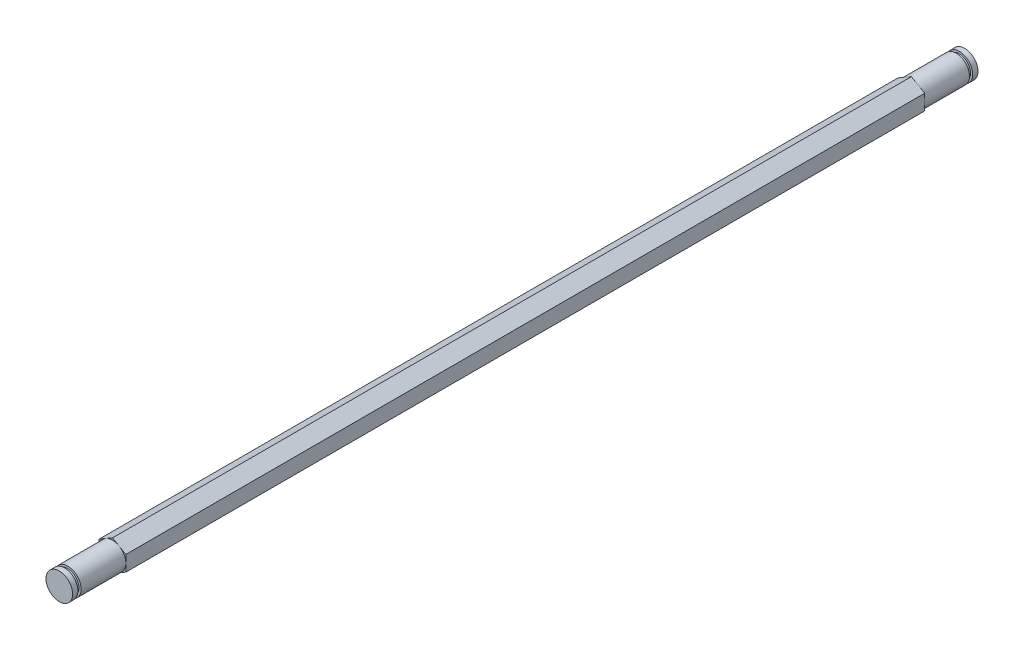
ISO-10303-21;
HEADER;
FILE_DESCRIPTION(('STEP AP214'),'2;1');
FILE_NAME('part.step','',(''),(''),'','','');
FILE_SCHEMA(('AUTOMOTIVE_DESIGN { 1 0 10303 214 1 1 1 1 }'));
ENDSEC;
DATA;
#1=APPLICATION_CONTEXT('core data for automotive mechanical design processes');
#2=APPLICATION_PROTOCOL_DEFINITION('international standard','automotive_design',2000,#1);
#3=PRODUCT_CONTEXT('',#1,'mechanical');
#4=PRODUCT('Part','Part','',(#3));
#5=PRODUCT_RELATED_PRODUCT_CATEGORY('part','',(#4));
#6=PRODUCT_DEFINITION_FORMATION('','',#4);
#7=PRODUCT_DEFINITION_CONTEXT('part definition',#1,'design');
#8=PRODUCT_DEFINITION('design','',#6,#7);
#9=PRODUCT_DEFINITION_SHAPE('','',#8);
#10=(LENGTH_UNIT() NAMED_UNIT(*) SI_UNIT(.MILLI.,.METRE.));
#11=(NAMED_UNIT(*) PLANE_ANGLE_UNIT() SI_UNIT($,.RADIAN.));
#12=(NAMED_UNIT(*) SI_UNIT($,.STERADIAN.) SOLID_ANGLE_UNIT());
#13=UNCERTAINTY_MEASURE_WITH_UNIT(LENGTH_MEASURE(1.E-05),#10,'distance_accuracy_value','');
#14=(GEOMETRIC_REPRESENTATION_CONTEXT(3) GLOBAL_UNCERTAINTY_ASSIGNED_CONTEXT((#13)) GLOBAL_UNIT_ASSIGNED_CONTEXT((#10,
#11,#12)) REPRESENTATION_CONTEXT('',''));
#15=CARTESIAN_POINT('',(0.,0.,0.));
#16=DIRECTION('',(0.,0.,1.));
#17=DIRECTION('',(1.,0.,0.));
#18=AXIS2_PLACEMENT_3D('',#15,#16,#17);
#19=CARTESIAN_POINT('',(0.,0.,12.7));
#20=DIRECTION('',(0.,0.,-1.));
#21=DIRECTION('',(-1.,0.,0.));
#22=AXIS2_PLACEMENT_3D('',#19,#20,#21);
#23=CYLINDRICAL_SURFACE('',#22,3.175);
#24=CARTESIAN_POINT('',(0.,0.,12.7));
#25=DIRECTION('',(0.,0.,-1.));
#26=DIRECTION('',(-1.,0.,0.));
#27=AXIS2_PLACEMENT_3D('',#24,#25,#26);
#28=CIRCLE('',#27,3.175);
#29=CARTESIAN_POINT('',(-1.5875,2.74963065701559,12.7));
#30=VERTEX_POINT('',#29);
#31=CARTESIAN_POINT('',(1.5875,2.74963065701559,12.7));
#32=VERTEX_POINT('',#31);
#33=EDGE_CURVE('E174',#30,#32,#28,.T.);
#34=ORIENTED_EDGE('',*,*,#33,.T.);
#35=CARTESIAN_POINT('',(3.17499999999999,0.,12.7));
#36=VERTEX_POINT('',#35);
#37=EDGE_CURVE('E69',#32,#36,#28,.T.);
#38=ORIENTED_EDGE('',*,*,#37,.T.);
#39=CARTESIAN_POINT('',(1.5875,-2.74963065701559,12.7));
#40=VERTEX_POINT('',#39);
#41=EDGE_CURVE('E285',#36,#40,#28,.T.);
#42=ORIENTED_EDGE('',*,*,#41,.T.);
#43=CARTESIAN_POINT('',(-1.5875,-2.74963065701559,12.7));
#44=VERTEX_POINT('',#43);
#45=EDGE_CURVE('E274',#40,#44,#28,.T.);
#46=ORIENTED_EDGE('',*,*,#45,.T.);
#47=CARTESIAN_POINT('',(-3.175,0.,12.7));
#48=VERTEX_POINT('',#47);
#49=EDGE_CURVE('E142',#44,#48,#28,.T.);
#50=ORIENTED_EDGE('',*,*,#49,.T.);
#51=EDGE_CURVE('E170',#48,#30,#28,.T.);
#52=ORIENTED_EDGE('',*,*,#51,.T.);
#53=EDGE_LOOP('',(#34,#38,#42,#46,#50,#52));
#54=FACE_BOUND('',#53,.T.);
#55=CARTESIAN_POINT('',(0.,0.,2.03199999999999));
#56=DIRECTION('',(0.,0.,-1.));
#57=DIRECTION('',(-1.,0.,0.));
#58=AXIS2_PLACEMENT_3D('',#55,#56,#57);
#59=CIRCLE('',#58,3.175);
#60=CARTESIAN_POINT('',(-3.175,0.,2.03199999999999));
#61=VERTEX_POINT('',#60);
#62=EDGE_CURVE('E48',#61,#61,#59,.F.);
#63=ORIENTED_EDGE('',*,*,#62,.T.);
#64=EDGE_LOOP('',(#63));
#65=FACE_BOUND('',#64,.T.);
#66=ADVANCED_FACE('F44',(#54,#65),#23,.T.);
#67=CARTESIAN_POINT('',(0.,0.,203.2));
#68=DIRECTION('',(0.,0.,1.));
#69=DIRECTION('',(1.,0.,0.));
#70=AXIS2_PLACEMENT_3D('',#67,#68,#69);
#71=CYLINDRICAL_SURFACE('',#70,3.175);
#72=CARTESIAN_POINT('',(0.,0.,203.2));
#73=DIRECTION('',(0.,0.,1.));
#74=DIRECTION('',(1.,0.,0.));
#75=AXIS2_PLACEMENT_3D('',#72,#73,#74);
#76=CIRCLE('',#75,3.175);
#77=CARTESIAN_POINT('',(3.17499999999999,0.,203.2));
#78=VERTEX_POINT('',#77);
#79=CARTESIAN_POINT('',(1.5875,2.74963065701559,203.2));
#80=VERTEX_POINT('',#79);
#81=EDGE_CURVE('E61',#78,#80,#76,.T.);
#82=ORIENTED_EDGE('',*,*,#81,.T.);
#83=CARTESIAN_POINT('',(-1.5875,2.74963065701559,203.2));
#84=VERTEX_POINT('',#83);
#85=EDGE_CURVE('E147',#80,#84,#76,.T.);
#86=ORIENTED_EDGE('',*,*,#85,.T.);
#87=CARTESIAN_POINT('',(-3.175,0.,203.2));
#88=VERTEX_POINT('',#87);
#89=EDGE_CURVE('E155',#84,#88,#76,.T.);
#90=ORIENTED_EDGE('',*,*,#89,.T.);
#91=CARTESIAN_POINT('',(-1.5875,-2.74963065701559,203.2));
#92=VERTEX_POINT('',#91);
#93=EDGE_CURVE('E251',#88,#92,#76,.T.);
#94=ORIENTED_EDGE('',*,*,#93,.T.);
#95=CARTESIAN_POINT('',(1.5875,-2.74963065701559,203.2));
#96=VERTEX_POINT('',#95);
#97=EDGE_CURVE('E256',#92,#96,#76,.T.);
#98=ORIENTED_EDGE('',*,*,#97,.T.);
#99=EDGE_CURVE('E161',#96,#78,#76,.T.);
#100=ORIENTED_EDGE('',*,*,#99,.T.);
#101=EDGE_LOOP('',(#82,#86,#90,#94,#98,#100));
#102=FACE_BOUND('',#101,.T.);
#103=CARTESIAN_POINT('',(0.,0.,213.868));
#104=DIRECTION('',(0.,0.,1.));
#105=DIRECTION('',(1.,0.,0.));
#106=AXIS2_PLACEMENT_3D('',#103,#104,#105);
#107=CIRCLE('',#106,3.175);
#108=CARTESIAN_POINT('',(3.175,0.,213.868));
#109=VERTEX_POINT('',#108);
#110=EDGE_CURVE('E216',#109,#109,#107,.F.);
#111=ORIENTED_EDGE('',*,*,#110,.T.);
#112=EDGE_LOOP('',(#111));
#113=FACE_BOUND('',#112,.T.);
#114=ADVANCED_FACE('F157',(#102,#113),#71,.T.);
#115=CARTESIAN_POINT('',(3.17499999999998,1.83308710467708,215.9));
#116=DIRECTION('',(-0.5,-0.866025403784438,0.));
#117=DIRECTION('',(0.866025403784439,-0.5,0.));
#118=AXIS2_PLACEMENT_3D('',#115,#116,#117);
#119=PLANE('',#118);
#120=DIRECTION('',(-0.866025403784439,0.5,0.));
#121=VECTOR('',#120,1.);
#122=CARTESIAN_POINT('',(3.17499999999998,1.83308710467708,203.2));
#123=LINE('',#122,#121);
#124=CARTESIAN_POINT('',(3.17499999999998,1.83308710467708,203.2));
#125=VERTEX_POINT('',#124);
#126=EDGE_CURVE('E135',#125,#80,#123,.T.);
#127=ORIENTED_EDGE('',*,*,#126,.F.);
#128=DIRECTION('',(0.,0.,-1.));
#129=VECTOR('',#128,1.);
#130=CARTESIAN_POINT('',(3.17499999999998,1.83308710467708,215.9));
#131=LINE('',#130,#129);
#132=CARTESIAN_POINT('',(3.17499999999998,1.83308710467708,12.7));
#133=VERTEX_POINT('',#132);
#134=EDGE_CURVE('E192',#125,#133,#131,.T.);
#135=ORIENTED_EDGE('',*,*,#134,.T.);
#136=DIRECTION('',(0.866025403784439,-0.5,0.));
#137=VECTOR('',#136,1.);
#138=CARTESIAN_POINT('',(3.17499999999998,1.83308710467708,12.7));
#139=LINE('',#138,#137);
#140=EDGE_CURVE('E176',#32,#133,#139,.T.);
#141=ORIENTED_EDGE('',*,*,#140,.F.);
#142=CARTESIAN_POINT('',(0.,3.66617420935413,12.7));
#143=VERTEX_POINT('',#142);
#144=EDGE_CURVE('E180',#143,#32,#139,.T.);
#145=ORIENTED_EDGE('',*,*,#144,.F.);
#146=DIRECTION('',(0.,0.,-1.));
#147=VECTOR('',#146,1.);
#148=CARTESIAN_POINT('',(0.,3.66617420935413,215.9));
#149=LINE('',#148,#147);
#150=CARTESIAN_POINT('',(0.,3.66617420935413,203.2));
#151=VERTEX_POINT('',#150);
#152=EDGE_CURVE('E165',#151,#143,#149,.T.);
#153=ORIENTED_EDGE('',*,*,#152,.F.);
#154=EDGE_CURVE('E143',#80,#151,#123,.T.);
#155=ORIENTED_EDGE('',*,*,#154,.F.);
#156=EDGE_LOOP('',(#127,#135,#141,#145,#153,#155));
#157=FACE_BOUND('',#156,.T.);
#158=ADVANCED_FACE('F46',(#157),#119,.F.);
#159=CARTESIAN_POINT('',(0.,3.66617420935413,215.9));
#160=DIRECTION('',(0.5,-0.866025403784439,0.));
#161=DIRECTION('',(0.866025403784439,0.5,0.));
#162=AXIS2_PLACEMENT_3D('',#159,#160,#161);
#163=PLANE('',#162);
#164=DIRECTION('',(-0.866025403784439,-0.5,0.));
#165=VECTOR('',#164,1.);
#166=CARTESIAN_POINT('',(0.,3.66617420935413,203.2));
#167=LINE('',#166,#165);
#168=EDGE_CURVE('E150',#151,#84,#167,.T.);
#169=ORIENTED_EDGE('',*,*,#168,.F.);
#170=ORIENTED_EDGE('',*,*,#152,.T.);
#171=DIRECTION('',(0.866025403784439,0.5,0.));
#172=VECTOR('',#171,1.);
#173=CARTESIAN_POINT('',(0.,3.66617420935413,12.7));
#174=LINE('',#173,#172);
#175=EDGE_CURVE('E183',#30,#143,#174,.T.);
#176=ORIENTED_EDGE('',*,*,#175,.F.);
#177=CARTESIAN_POINT('',(-3.175,1.83308710467706,12.7));
#178=VERTEX_POINT('',#177);
#179=EDGE_CURVE('E187',#178,#30,#174,.T.);
#180=ORIENTED_EDGE('',*,*,#179,.F.);
#181=DIRECTION('',(0.,0.,-1.));
#182=VECTOR('',#181,1.);
#183=CARTESIAN_POINT('',(-3.175,1.83308710467706,215.9));
#184=LINE('',#183,#182);
#185=CARTESIAN_POINT('',(-3.175,1.83308710467706,203.2));
#186=VERTEX_POINT('',#185);
#187=EDGE_CURVE('E200',#186,#178,#184,.T.);
#188=ORIENTED_EDGE('',*,*,#187,.F.);
#189=EDGE_CURVE('E166',#84,#186,#167,.T.);
#190=ORIENTED_EDGE('',*,*,#189,.F.);
#191=EDGE_LOOP('',(#169,#170,#176,#180,#188,#190));
#192=FACE_BOUND('',#191,.T.);
#193=ADVANCED_FACE('F345',(#192),#163,.F.);
#194=CARTESIAN_POINT('',(-3.175,1.83308710467706,215.9));
#195=DIRECTION('',(1.,0.,0.));
#196=DIRECTION('',(0.,0.,-1.));
#197=AXIS2_PLACEMENT_3D('',#194,#195,#196);
#198=PLANE('',#197);
#199=DIRECTION('',(0.,-1.,0.));
#200=VECTOR('',#199,1.);
#201=CARTESIAN_POINT('',(-3.175,1.83308710467706,203.2));
#202=LINE('',#201,#200);
#203=EDGE_CURVE('E243',#186,#88,#202,.T.);
#204=ORIENTED_EDGE('',*,*,#203,.F.);
#205=ORIENTED_EDGE('',*,*,#187,.T.);
#206=DIRECTION('',(0.,1.,0.));
#207=VECTOR('',#206,1.);
#208=CARTESIAN_POINT('',(-3.175,1.83308710467706,12.7));
#209=LINE('',#208,#207);
#210=EDGE_CURVE('E188',#48,#178,#209,.T.);
#211=ORIENTED_EDGE('',*,*,#210,.F.);
#212=CARTESIAN_POINT('',(-3.175,-1.83308710467707,12.7));
#213=VERTEX_POINT('',#212);
#214=EDGE_CURVE('E191',#213,#48,#209,.T.);
#215=ORIENTED_EDGE('',*,*,#214,.F.);
#216=DIRECTION('',(0.,0.,-1.));
#217=VECTOR('',#216,1.);
#218=CARTESIAN_POINT('',(-3.175,-1.83308710467707,215.9));
#219=LINE('',#218,#217);
#220=CARTESIAN_POINT('',(-3.175,-1.83308710467707,203.2));
#221=VERTEX_POINT('',#220);
#222=EDGE_CURVE('E198',#221,#213,#219,.T.);
#223=ORIENTED_EDGE('',*,*,#222,.F.);
#224=EDGE_CURVE('E242',#88,#221,#202,.T.);
#225=ORIENTED_EDGE('',*,*,#224,.F.);
#226=EDGE_LOOP('',(#204,#205,#211,#215,#223,#225));
#227=FACE_BOUND('',#226,.T.);
#228=ADVANCED_FACE('F343',(#227),#198,.F.);
#229=CARTESIAN_POINT('',(-3.175,-1.83308710467707,215.9));
#230=DIRECTION('',(0.5,0.866025403784439,0.));
#231=DIRECTION('',(-0.866025403784439,0.5,0.));
#232=AXIS2_PLACEMENT_3D('',#229,#230,#231);
#233=PLANE('',#232);
#234=DIRECTION('',(0.866025403784439,-0.5,0.));
#235=VECTOR('',#234,1.);
#236=CARTESIAN_POINT('',(-3.175,-1.83308710467707,203.2));
#237=LINE('',#236,#235);
#238=EDGE_CURVE('E241',#221,#92,#237,.T.);
#239=ORIENTED_EDGE('',*,*,#238,.F.);
#240=ORIENTED_EDGE('',*,*,#222,.T.);
#241=DIRECTION('',(-0.866025403784439,0.5,0.));
#242=VECTOR('',#241,1.);
#243=CARTESIAN_POINT('',(-3.175,-1.83308710467707,12.7));
#244=LINE('',#243,#242);
#245=EDGE_CURVE('E184',#44,#213,#244,.T.);
#246=ORIENTED_EDGE('',*,*,#245,.F.);
#247=CARTESIAN_POINT('',(0.,-3.66617420935413,12.7));
#248=VERTEX_POINT('',#247);
#249=EDGE_CURVE('E181',#248,#44,#244,.T.);
#250=ORIENTED_EDGE('',*,*,#249,.F.);
#251=DIRECTION('',(0.,0.,-1.));
#252=VECTOR('',#251,1.);
#253=CARTESIAN_POINT('',(0.,-3.66617420935413,215.9));
#254=LINE('',#253,#252);
#255=CARTESIAN_POINT('',(0.,-3.66617420935413,203.2));
#256=VERTEX_POINT('',#255);
#257=EDGE_CURVE('E196',#256,#248,#254,.T.);
#258=ORIENTED_EDGE('',*,*,#257,.F.);
#259=EDGE_CURVE('E240',#92,#256,#237,.T.);
#260=ORIENTED_EDGE('',*,*,#259,.F.);
#261=EDGE_LOOP('',(#239,#240,#246,#250,#258,#260));
#262=FACE_BOUND('',#261,.T.);
#263=ADVANCED_FACE('F261',(#262),#233,.F.);
#264=CARTESIAN_POINT('',(0.,-3.66617420935413,215.9));
#265=DIRECTION('',(-0.5,0.866025403784439,0.));
#266=DIRECTION('',(-0.866025403784439,-0.5,0.));
#267=AXIS2_PLACEMENT_3D('',#264,#265,#266);
#268=PLANE('',#267);
#269=DIRECTION('',(0.866025403784439,0.5,0.));
#270=VECTOR('',#269,1.);
#271=CARTESIAN_POINT('',(0.,-3.66617420935413,203.2));
#272=LINE('',#271,#270);
#273=EDGE_CURVE('E239',#256,#96,#272,.T.);
#274=ORIENTED_EDGE('',*,*,#273,.F.);
#275=ORIENTED_EDGE('',*,*,#257,.T.);
#276=DIRECTION('',(-0.866025403784439,-0.5,0.));
#277=VECTOR('',#276,1.);
#278=CARTESIAN_POINT('',(0.,-3.66617420935413,12.7));
#279=LINE('',#278,#277);
#280=EDGE_CURVE('E177',#40,#248,#279,.T.);
#281=ORIENTED_EDGE('',*,*,#280,.F.);
#282=CARTESIAN_POINT('',(3.17499999999999,-1.83308710467707,12.7));
#283=VERTEX_POINT('',#282);
#284=EDGE_CURVE('E173',#283,#40,#279,.T.);
#285=ORIENTED_EDGE('',*,*,#284,.F.);
#286=DIRECTION('',(0.,0.,-1.));
#287=VECTOR('',#286,1.);
#288=CARTESIAN_POINT('',(3.17499999999999,-1.83308710467707,215.9));
#289=LINE('',#288,#287);
#290=CARTESIAN_POINT('',(3.17499999999999,-1.83308710467707,203.2));
#291=VERTEX_POINT('',#290);
#292=EDGE_CURVE('E194',#291,#283,#289,.T.);
#293=ORIENTED_EDGE('',*,*,#292,.F.);
#294=EDGE_CURVE('E162',#96,#291,#272,.T.);
#295=ORIENTED_EDGE('',*,*,#294,.F.);
#296=EDGE_LOOP('',(#274,#275,#281,#285,#293,#295));
#297=FACE_BOUND('',#296,.T.);
#298=ADVANCED_FACE('F267',(#297),#268,.F.);
#299=CARTESIAN_POINT('',(3.17499999999999,-1.83308710467707,215.9));
#300=DIRECTION('',(-1.,0.,0.));
#301=DIRECTION('',(0.,-1.,0.));
#302=AXIS2_PLACEMENT_3D('',#299,#300,#301);
#303=PLANE('',#302);
#304=DIRECTION('',(0.,1.,0.));
#305=VECTOR('',#304,1.);
#306=CARTESIAN_POINT('',(3.17499999999999,-1.83308710467707,203.2));
#307=LINE('',#306,#305);
#308=EDGE_CURVE('E12',#291,#78,#307,.T.);
#309=ORIENTED_EDGE('',*,*,#308,.F.);
#310=ORIENTED_EDGE('',*,*,#292,.T.);
#311=DIRECTION('',(0.,-1.,0.));
#312=VECTOR('',#311,1.);
#313=CARTESIAN_POINT('',(3.17499999999999,-1.83308710467707,12.7));
#314=LINE('',#313,#312);
#315=EDGE_CURVE('E206',#36,#283,#314,.T.);
#316=ORIENTED_EDGE('',*,*,#315,.F.);
#317=EDGE_CURVE('E209',#133,#36,#314,.T.);
#318=ORIENTED_EDGE('',*,*,#317,.F.);
#319=ORIENTED_EDGE('',*,*,#134,.F.);
#320=EDGE_CURVE('E53',#78,#125,#307,.T.);
#321=ORIENTED_EDGE('',*,*,#320,.F.);
#322=EDGE_LOOP('',(#309,#310,#316,#318,#319,#321));
#323=FACE_BOUND('',#322,.T.);
#324=ADVANCED_FACE('F291',(#323),#303,.F.);
#325=CARTESIAN_POINT('',(0.,0.,12.7));
#326=DIRECTION('',(0.,0.,-1.));
#327=DIRECTION('',(-1.,0.,0.));
#328=AXIS2_PLACEMENT_3D('',#325,#326,#327);
#329=PLANE('',#328);
#330=ORIENTED_EDGE('',*,*,#214,.T.);
#331=ORIENTED_EDGE('',*,*,#49,.F.);
#332=ORIENTED_EDGE('',*,*,#245,.T.);
#333=EDGE_LOOP('',(#330,#331,#332));
#334=FACE_BOUND('',#333,.T.);
#335=ADVANCED_FACE('F338',(#334),#329,.T.);
#336=ORIENTED_EDGE('',*,*,#210,.T.);
#337=ORIENTED_EDGE('',*,*,#179,.T.);
#338=ORIENTED_EDGE('',*,*,#51,.F.);
#339=EDGE_LOOP('',(#336,#337,#338));
#340=FACE_BOUND('',#339,.T.);
#341=ADVANCED_FACE('F362',(#340),#329,.T.);
#342=ORIENTED_EDGE('',*,*,#175,.T.);
#343=ORIENTED_EDGE('',*,*,#144,.T.);
#344=ORIENTED_EDGE('',*,*,#33,.F.);
#345=EDGE_LOOP('',(#342,#343,#344));
#346=FACE_BOUND('',#345,.T.);
#347=ADVANCED_FACE('F277',(#346),#329,.T.);
#348=ORIENTED_EDGE('',*,*,#249,.T.);
#349=ORIENTED_EDGE('',*,*,#45,.F.);
#350=ORIENTED_EDGE('',*,*,#280,.T.);
#351=EDGE_LOOP('',(#348,#349,#350));
#352=FACE_BOUND('',#351,.T.);
#353=ADVANCED_FACE('F271',(#352),#329,.T.);
#354=ORIENTED_EDGE('',*,*,#140,.T.);
#355=ORIENTED_EDGE('',*,*,#317,.T.);
#356=ORIENTED_EDGE('',*,*,#37,.F.);
#357=EDGE_LOOP('',(#354,#355,#356));
#358=FACE_BOUND('',#357,.T.);
#359=ADVANCED_FACE('F282',(#358),#329,.T.);
#360=ORIENTED_EDGE('',*,*,#284,.T.);
#361=ORIENTED_EDGE('',*,*,#41,.F.);
#362=ORIENTED_EDGE('',*,*,#315,.T.);
#363=EDGE_LOOP('',(#360,#361,#362));
#364=FACE_BOUND('',#363,.T.);
#365=ADVANCED_FACE('F294',(#364),#329,.T.);
#366=CARTESIAN_POINT('',(0.,0.,203.2));
#367=DIRECTION('',(0.,0.,1.));
#368=DIRECTION('',(1.,0.,0.));
#369=AXIS2_PLACEMENT_3D('',#366,#367,#368);
#370=PLANE('',#369);
#371=ORIENTED_EDGE('',*,*,#126,.T.);
#372=ORIENTED_EDGE('',*,*,#81,.F.);
#373=ORIENTED_EDGE('',*,*,#320,.T.);
#374=EDGE_LOOP('',(#371,#372,#373));
#375=FACE_BOUND('',#374,.T.);
#376=ADVANCED_FACE('F137',(#375),#370,.T.);
#377=ORIENTED_EDGE('',*,*,#154,.T.);
#378=ORIENTED_EDGE('',*,*,#168,.T.);
#379=ORIENTED_EDGE('',*,*,#85,.F.);
#380=EDGE_LOOP('',(#377,#378,#379));
#381=FACE_BOUND('',#380,.T.);
#382=ADVANCED_FACE('F148',(#381),#370,.T.);
#383=ORIENTED_EDGE('',*,*,#189,.T.);
#384=ORIENTED_EDGE('',*,*,#203,.T.);
#385=ORIENTED_EDGE('',*,*,#89,.F.);
#386=EDGE_LOOP('',(#383,#384,#385));
#387=FACE_BOUND('',#386,.T.);
#388=ADVANCED_FACE('F356',(#387),#370,.T.);
#389=ORIENTED_EDGE('',*,*,#224,.T.);
#390=ORIENTED_EDGE('',*,*,#238,.T.);
#391=ORIENTED_EDGE('',*,*,#93,.F.);
#392=EDGE_LOOP('',(#389,#390,#391));
#393=FACE_BOUND('',#392,.T.);
#394=ADVANCED_FACE('F249',(#393),#370,.T.);
#395=ORIENTED_EDGE('',*,*,#259,.T.);
#396=ORIENTED_EDGE('',*,*,#273,.T.);
#397=ORIENTED_EDGE('',*,*,#97,.F.);
#398=EDGE_LOOP('',(#395,#396,#397));
#399=FACE_BOUND('',#398,.T.);
#400=ADVANCED_FACE('F257',(#399),#370,.T.);
#401=ORIENTED_EDGE('',*,*,#294,.T.);
#402=ORIENTED_EDGE('',*,*,#308,.T.);
#403=ORIENTED_EDGE('',*,*,#99,.F.);
#404=EDGE_LOOP('',(#401,#402,#403));
#405=FACE_BOUND('',#404,.T.);
#406=ADVANCED_FACE('F296',(#405),#370,.T.);
#407=CARTESIAN_POINT('',(0.,0.,213.868));
#408=DIRECTION('',(0.,0.,1.));
#409=DIRECTION('',(1.,0.,0.));
#410=AXIS2_PLACEMENT_3D('',#407,#408,#409);
#411=PLANE('',#410);
#412=ORIENTED_EDGE('',*,*,#110,.F.);
#413=EDGE_LOOP('',(#412));
#414=FACE_BOUND('',#413,.T.);
#415=CARTESIAN_POINT('',(0.,0.,213.868));
#416=DIRECTION('',(0.,0.,1.));
#417=DIRECTION('',(1.,0.,0.));
#418=AXIS2_PLACEMENT_3D('',#415,#416,#417);
#419=CIRCLE('',#418,2.667);
#420=CARTESIAN_POINT('',(2.667,0.,213.868));
#421=VERTEX_POINT('',#420);
#422=EDGE_CURVE('E217',#421,#421,#419,.T.);
#423=ORIENTED_EDGE('',*,*,#422,.F.);
#424=EDGE_LOOP('',(#423));
#425=FACE_BOUND('',#424,.T.);
#426=ADVANCED_FACE('F298',(#414,#425),#411,.T.);
#427=CARTESIAN_POINT('',(0.,0.,214.63));
#428=DIRECTION('',(0.,0.,1.));
#429=DIRECTION('',(1.,0.,0.));
#430=AXIS2_PLACEMENT_3D('',#427,#428,#429);
#431=PLANE('',#430);
#432=CARTESIAN_POINT('',(0.,0.,214.63));
#433=DIRECTION('',(0.,0.,1.));
#434=DIRECTION('',(1.,0.,0.));
#435=AXIS2_PLACEMENT_3D('',#432,#433,#434);
#436=CIRCLE('',#435,3.175);
#437=CARTESIAN_POINT('',(3.175,0.,214.63));
#438=VERTEX_POINT('',#437);
#439=EDGE_CURVE('E213',#438,#438,#436,.F.);
#440=ORIENTED_EDGE('',*,*,#439,.T.);
#441=EDGE_LOOP('',(#440));
#442=FACE_BOUND('',#441,.T.);
#443=CARTESIAN_POINT('',(0.,0.,214.63));
#444=DIRECTION('',(0.,0.,1.));
#445=DIRECTION('',(1.,0.,0.));
#446=AXIS2_PLACEMENT_3D('',#443,#444,#445);
#447=CIRCLE('',#446,2.667);
#448=CARTESIAN_POINT('',(2.667,0.,214.63));
#449=VERTEX_POINT('',#448);
#450=EDGE_CURVE('E225',#449,#449,#447,.T.);
#451=ORIENTED_EDGE('',*,*,#450,.T.);
#452=EDGE_LOOP('',(#451));
#453=FACE_BOUND('',#452,.T.);
#454=ADVANCED_FACE('F304',(#442,#453),#431,.F.);
#455=CARTESIAN_POINT('',(0.,0.,213.868));
#456=DIRECTION('',(0.,0.,1.));
#457=DIRECTION('',(1.,0.,0.));
#458=AXIS2_PLACEMENT_3D('',#455,#456,#457);
#459=CYLINDRICAL_SURFACE('',#458,2.667);
#460=CARTESIAN_POINT('',(2.667,0.,213.868));
#461=CARTESIAN_POINT('',(2.667,0.,213.8759375));
#462=CARTESIAN_POINT('',(2.667,0.,213.883875));
#463=CARTESIAN_POINT('',(2.667,0.,213.89975));
#464=CARTESIAN_POINT('',(2.667,0.,213.9076875));
#465=CARTESIAN_POINT('',(2.667,0.,213.9235625));
#466=CARTESIAN_POINT('',(2.667,0.,213.9315));
#467=CARTESIAN_POINT('',(2.667,0.,213.947375));
#468=CARTESIAN_POINT('',(2.667,0.,213.9553125));
#469=CARTESIAN_POINT('',(2.667,0.,213.9711875));
#470=CARTESIAN_POINT('',(2.667,0.,213.979125));
#471=CARTESIAN_POINT('',(2.667,0.,213.995));
#472=CARTESIAN_POINT('',(2.667,0.,214.0029375));
#473=CARTESIAN_POINT('',(2.667,0.,214.0188125));
#474=CARTESIAN_POINT('',(2.667,0.,214.02675));
#475=CARTESIAN_POINT('',(2.667,0.,214.042625));
#476=CARTESIAN_POINT('',(2.667,0.,214.0505625));
#477=CARTESIAN_POINT('',(2.667,0.,214.0664375));
#478=CARTESIAN_POINT('',(2.667,0.,214.074375));
#479=CARTESIAN_POINT('',(2.667,0.,214.09025));
#480=CARTESIAN_POINT('',(2.667,0.,214.0981875));
#481=CARTESIAN_POINT('',(2.667,0.,214.1140625));
#482=CARTESIAN_POINT('',(2.667,0.,214.122));
#483=CARTESIAN_POINT('',(2.667,0.,214.137875));
#484=CARTESIAN_POINT('',(2.667,0.,214.1458125));
#485=CARTESIAN_POINT('',(2.667,0.,214.1616875));
#486=CARTESIAN_POINT('',(2.667,0.,214.169625));
#487=CARTESIAN_POINT('',(2.667,0.,214.1855));
#488=CARTESIAN_POINT('',(2.667,0.,214.1934375));
#489=CARTESIAN_POINT('',(2.667,0.,214.2093125));
#490=CARTESIAN_POINT('',(2.667,0.,214.21725));
#491=CARTESIAN_POINT('',(2.667,0.,214.233125));
#492=CARTESIAN_POINT('',(2.667,0.,214.2410625));
#493=CARTESIAN_POINT('',(2.667,0.,214.2569375));
#494=CARTESIAN_POINT('',(2.667,0.,214.264875));
#495=CARTESIAN_POINT('',(2.667,0.,214.28075));
#496=CARTESIAN_POINT('',(2.667,0.,214.2886875));
#497=CARTESIAN_POINT('',(2.667,0.,214.3045625));
#498=CARTESIAN_POINT('',(2.667,0.,214.3125));
#499=CARTESIAN_POINT('',(2.667,0.,214.328375));
#500=CARTESIAN_POINT('',(2.667,0.,214.3363125));
#501=CARTESIAN_POINT('',(2.667,0.,214.3521875));
#502=CARTESIAN_POINT('',(2.667,0.,214.360125));
#503=CARTESIAN_POINT('',(2.667,0.,214.376));
#504=CARTESIAN_POINT('',(2.667,0.,214.3839375));
#505=CARTESIAN_POINT('',(2.667,0.,214.3998125));
#506=CARTESIAN_POINT('',(2.667,0.,214.40775));
#507=CARTESIAN_POINT('',(2.667,0.,214.423625));
#508=CARTESIAN_POINT('',(2.667,0.,214.4315625));
#509=CARTESIAN_POINT('',(2.667,0.,214.4474375));
#510=CARTESIAN_POINT('',(2.667,0.,214.455375));
#511=CARTESIAN_POINT('',(2.667,0.,214.47125));
#512=CARTESIAN_POINT('',(2.667,0.,214.4791875));
#513=CARTESIAN_POINT('',(2.667,0.,214.4950625));
#514=CARTESIAN_POINT('',(2.667,0.,214.503));
#515=CARTESIAN_POINT('',(2.667,0.,214.518875));
#516=CARTESIAN_POINT('',(2.667,0.,214.5268125));
#517=CARTESIAN_POINT('',(2.667,0.,214.5426875));
#518=CARTESIAN_POINT('',(2.667,0.,214.550625));
#519=CARTESIAN_POINT('',(2.667,0.,214.5665));
#520=CARTESIAN_POINT('',(2.667,0.,214.5744375));
#521=CARTESIAN_POINT('',(2.667,0.,214.5903125));
#522=CARTESIAN_POINT('',(2.667,0.,214.59825));
#523=CARTESIAN_POINT('',(2.667,0.,214.614125));
#524=CARTESIAN_POINT('',(2.667,0.,214.6220625));
#525=CARTESIAN_POINT('',(2.667,0.,214.63));
#526=B_SPLINE_CURVE_WITH_KNOTS('',3,(#460,#461,#462,#463,#464,#465,#466,#467,#468,#469,#470,
#471,#472,#473,#474,#475,#476,#477,#478,#479,#480,#481,#482,#483,#484,#485,#486,#487,#488,#489,
#490,#491,#492,#493,#494,#495,#496,#497,#498,#499,#500,#501,#502,#503,#504,#505,#506,#507,#508,
#509,#510,#511,#512,#513,#514,#515,#516,#517,#518,#519,#520,#521,#522,#523,#524,#525),
.UNSPECIFIED.,.F.,.F.,(4,2,2,2,2,2,2,2,2,2,2,2,2,2,2,2,2,2,2,2,2,2,2,2,2,2,2,2,2,2,2,2,4),(0.,
0.0238124999999978,0.0476249999999956,0.0714374999999934,0.0952499999999912,0.119062499999989,
0.142874999999987,0.166687499999985,0.190499999999982,0.21431249999998,0.238124999999978,
0.261937500000003,0.285750000000001,0.309562499999999,0.333374999999997,0.357187499999995,
0.380999999999992,0.40481249999999,0.428624999999988,0.452437499999986,0.476249999999984,
0.500062499999981,0.523875000000007,0.547687500000005,0.571500000000003,0.5953125,
0.619124999999998,0.642937499999996,0.666749999999994,0.690562499999992,0.714374999999989,
0.738187499999987,0.761999999999985),.UNSPECIFIED.);
#527=EDGE_CURVE('BSEAM478',#421,#449,#526,.T.);
#528=ORIENTED_EDGE('',*,*,#422,.T.);
#529=ORIENTED_EDGE('',*,*,#450,.F.);
#530=ORIENTED_EDGE('',*,*,#527,.T.);
#531=ORIENTED_EDGE('',*,*,#527,.F.);
#532=EDGE_LOOP('',(#528,#530,#529,#531));
#533=FACE_BOUND('',#532,.T.);
#534=ADVANCED_FACE('F478',(#533),#459,.T.);
#535=CARTESIAN_POINT('',(0.,0.,215.9));
#536=DIRECTION('',(0.,0.,1.));
#537=DIRECTION('',(1.,0.,0.));
#538=AXIS2_PLACEMENT_3D('',#535,#536,#537);
#539=PLANE('',#538);
#540=CARTESIAN_POINT('',(0.,0.,215.9));
#541=DIRECTION('',(0.,0.,1.));
#542=DIRECTION('',(1.,0.,0.));
#543=AXIS2_PLACEMENT_3D('',#540,#541,#542);
#544=CIRCLE('',#543,3.175);
#545=CARTESIAN_POINT('',(3.175,0.,215.9));
#546=VERTEX_POINT('',#545);
#547=EDGE_CURVE('E210',#546,#546,#544,.T.);
#548=ORIENTED_EDGE('',*,*,#547,.T.);
#549=EDGE_LOOP('',(#548));
#550=FACE_BOUND('',#549,.T.);
#551=ADVANCED_FACE('F335',(#550),#539,.T.);
#552=ORIENTED_EDGE('',*,*,#439,.F.);
#553=EDGE_LOOP('',(#552));
#554=FACE_BOUND('',#553,.T.);
#555=ORIENTED_EDGE('',*,*,#547,.F.);
#556=EDGE_LOOP('',(#555));
#557=FACE_BOUND('',#556,.T.);
#558=ADVANCED_FACE('F315',(#554,#557),#71,.T.);
#559=CARTESIAN_POINT('',(0.,0.,2.03199999999999));
#560=DIRECTION('',(0.,0.,-1.));
#561=DIRECTION('',(-1.,0.,0.));
#562=AXIS2_PLACEMENT_3D('',#559,#560,#561);
#563=PLANE('',#562);
#564=ORIENTED_EDGE('',*,*,#62,.F.);
#565=EDGE_LOOP('',(#564));
#566=FACE_BOUND('',#565,.T.);
#567=CARTESIAN_POINT('',(0.,0.,2.032));
#568=DIRECTION('',(0.,0.,-1.));
#569=DIRECTION('',(-1.,0.,0.));
#570=AXIS2_PLACEMENT_3D('',#567,#568,#569);
#571=CIRCLE('',#570,2.667);
#572=CARTESIAN_POINT('',(-2.667,0.,2.032));
#573=VERTEX_POINT('',#572);
#574=EDGE_CURVE('E221',#573,#573,#571,.T.);
#575=ORIENTED_EDGE('',*,*,#574,.F.);
#576=EDGE_LOOP('',(#575));
#577=FACE_BOUND('',#576,.T.);
#578=ADVANCED_FACE('F517',(#566,#577),#563,.T.);
#579=CARTESIAN_POINT('',(0.,0.,1.26999999999999));
#580=DIRECTION('',(0.,0.,-1.));
#581=DIRECTION('',(-1.,0.,0.));
#582=AXIS2_PLACEMENT_3D('',#579,#580,#581);
#583=PLANE('',#582);
#584=CARTESIAN_POINT('',(0.,0.,1.26999999999999));
#585=DIRECTION('',(0.,0.,-1.));
#586=DIRECTION('',(-1.,0.,0.));
#587=AXIS2_PLACEMENT_3D('',#584,#585,#586);
#588=CIRCLE('',#587,3.175);
#589=CARTESIAN_POINT('',(-3.175,0.,1.26999999999999));
#590=VERTEX_POINT('',#589);
#591=EDGE_CURVE('E219',#590,#590,#588,.F.);
#592=ORIENTED_EDGE('',*,*,#591,.T.);
#593=EDGE_LOOP('',(#592));
#594=FACE_BOUND('',#593,.T.);
#595=CARTESIAN_POINT('',(0.,0.,1.27));
#596=DIRECTION('',(0.,0.,-1.));
#597=DIRECTION('',(-1.,0.,0.));
#598=AXIS2_PLACEMENT_3D('',#595,#596,#597);
#599=CIRCLE('',#598,2.667);
#600=CARTESIAN_POINT('',(-2.667,0.,1.27));
#601=VERTEX_POINT('',#600);
#602=EDGE_CURVE('E227',#601,#601,#599,.T.);
#603=ORIENTED_EDGE('',*,*,#602,.T.);
#604=EDGE_LOOP('',(#603));
#605=FACE_BOUND('',#604,.T.);
#606=ADVANCED_FACE('F331',(#594,#605),#583,.F.);
#607=CARTESIAN_POINT('',(0.,0.,2.032));
#608=DIRECTION('',(0.,0.,-1.));
#609=DIRECTION('',(-1.,0.,0.));
#610=AXIS2_PLACEMENT_3D('',#607,#608,#609);
#611=CYLINDRICAL_SURFACE('',#610,2.667);
#612=CARTESIAN_POINT('',(-2.667,0.,2.032));
#613=CARTESIAN_POINT('',(-2.667,0.,2.0240625));
#614=CARTESIAN_POINT('',(-2.667,0.,2.016125));
#615=CARTESIAN_POINT('',(-2.667,0.,2.00025));
#616=CARTESIAN_POINT('',(-2.667,0.,1.9923125));
#617=CARTESIAN_POINT('',(-2.667,0.,1.9764375));
#618=CARTESIAN_POINT('',(-2.667,0.,1.9685));
#619=CARTESIAN_POINT('',(-2.667,0.,1.952625));
#620=CARTESIAN_POINT('',(-2.667,0.,1.9446875));
#621=CARTESIAN_POINT('',(-2.667,0.,1.9288125));
#622=CARTESIAN_POINT('',(-2.667,0.,1.920875));
#623=CARTESIAN_POINT('',(-2.667,0.,1.905));
#624=CARTESIAN_POINT('',(-2.667,0.,1.8970625));
#625=CARTESIAN_POINT('',(-2.667,0.,1.8811875));
#626=CARTESIAN_POINT('',(-2.667,0.,1.87325));
#627=CARTESIAN_POINT('',(-2.667,0.,1.857375));
#628=CARTESIAN_POINT('',(-2.667,0.,1.8494375));
#629=CARTESIAN_POINT('',(-2.667,0.,1.8335625));
#630=CARTESIAN_POINT('',(-2.667,0.,1.825625));
#631=CARTESIAN_POINT('',(-2.667,0.,1.80975));
#632=CARTESIAN_POINT('',(-2.667,0.,1.8018125));
#633=CARTESIAN_POINT('',(-2.667,0.,1.7859375));
#634=CARTESIAN_POINT('',(-2.667,0.,1.778));
#635=CARTESIAN_POINT('',(-2.667,0.,1.762125));
#636=CARTESIAN_POINT('',(-2.667,0.,1.7541875));
#637=CARTESIAN_POINT('',(-2.667,0.,1.7383125));
#638=CARTESIAN_POINT('',(-2.667,0.,1.730375));
#639=CARTESIAN_POINT('',(-2.667,0.,1.7145));
#640=CARTESIAN_POINT('',(-2.667,0.,1.7065625));
#641=CARTESIAN_POINT('',(-2.667,0.,1.6906875));
#642=CARTESIAN_POINT('',(-2.667,0.,1.68275));
#643=CARTESIAN_POINT('',(-2.667,0.,1.666875));
#644=CARTESIAN_POINT('',(-2.667,0.,1.6589375));
#645=CARTESIAN_POINT('',(-2.667,0.,1.6430625));
#646=CARTESIAN_POINT('',(-2.667,0.,1.635125));
#647=CARTESIAN_POINT('',(-2.667,0.,1.61925));
#648=CARTESIAN_POINT('',(-2.667,0.,1.6113125));
#649=CARTESIAN_POINT('',(-2.667,0.,1.5954375));
#650=CARTESIAN_POINT('',(-2.667,0.,1.5875));
#651=CARTESIAN_POINT('',(-2.667,0.,1.571625));
#652=CARTESIAN_POINT('',(-2.667,0.,1.5636875));
#653=CARTESIAN_POINT('',(-2.667,0.,1.5478125));
#654=CARTESIAN_POINT('',(-2.667,0.,1.539875));
#655=CARTESIAN_POINT('',(-2.667,0.,1.524));
#656=CARTESIAN_POINT('',(-2.667,0.,1.5160625));
#657=CARTESIAN_POINT('',(-2.667,0.,1.5001875));
#658=CARTESIAN_POINT('',(-2.667,0.,1.49225));
#659=CARTESIAN_POINT('',(-2.667,0.,1.476375));
#660=CARTESIAN_POINT('',(-2.667,0.,1.4684375));
#661=CARTESIAN_POINT('',(-2.667,0.,1.4525625));
#662=CARTESIAN_POINT('',(-2.667,0.,1.444625));
#663=CARTESIAN_POINT('',(-2.667,0.,1.42875));
#664=CARTESIAN_POINT('',(-2.667,0.,1.4208125));
#665=CARTESIAN_POINT('',(-2.667,0.,1.4049375));
#666=CARTESIAN_POINT('',(-2.667,0.,1.397));
#667=CARTESIAN_POINT('',(-2.667,0.,1.381125));
#668=CARTESIAN_POINT('',(-2.667,0.,1.3731875));
#669=CARTESIAN_POINT('',(-2.667,0.,1.3573125));
#670=CARTESIAN_POINT('',(-2.667,0.,1.349375));
#671=CARTESIAN_POINT('',(-2.667,0.,1.3335));
#672=CARTESIAN_POINT('',(-2.667,0.,1.3255625));
#673=CARTESIAN_POINT('',(-2.667,0.,1.3096875));
#674=CARTESIAN_POINT('',(-2.667,0.,1.30175));
#675=CARTESIAN_POINT('',(-2.667,0.,1.285875));
#676=CARTESIAN_POINT('',(-2.667,0.,1.2779375));
#677=CARTESIAN_POINT('',(-2.667,0.,1.27));
#678=B_SPLINE_CURVE_WITH_KNOTS('',3,(#612,#613,#614,#615,#616,#617,#618,#619,#620,#621,#622,
#623,#624,#625,#626,#627,#628,#629,#630,#631,#632,#633,#634,#635,#636,#637,#638,#639,#640,#641,
#642,#643,#644,#645,#646,#647,#648,#649,#650,#651,#652,#653,#654,#655,#656,#657,#658,#659,#660,
#661,#662,#663,#664,#665,#666,#667,#668,#669,#670,#671,#672,#673,#674,#675,#676,#677),
.UNSPECIFIED.,.F.,.F.,(4,2,2,2,2,2,2,2,2,2,2,2,2,2,2,2,2,2,2,2,2,2,2,2,2,2,2,2,2,2,2,2,4),(0.,
0.0238125,0.0476249999999999,0.0714374999999999,0.0952499999999998,0.1190625,0.142875,0.1666875,
0.1905,0.2143125,0.238125,0.2619375,0.28575,0.3095625,0.333375,0.3571875,0.381,0.4048125,
0.428625,0.4524375,0.47625,0.5000625,0.523875,0.5476875,0.5715,0.5953125,0.619125,0.6429375,
0.66675,0.6905625,0.714375,0.7381875,0.762),.UNSPECIFIED.);
#679=EDGE_CURVE('BSEAM323',#573,#601,#678,.T.);
#680=ORIENTED_EDGE('',*,*,#574,.T.);
#681=ORIENTED_EDGE('',*,*,#602,.F.);
#682=ORIENTED_EDGE('',*,*,#679,.T.);
#683=ORIENTED_EDGE('',*,*,#679,.F.);
#684=EDGE_LOOP('',(#680,#682,#681,#683));
#685=FACE_BOUND('',#684,.T.);
#686=ADVANCED_FACE('F323',(#685),#611,.T.);
#687=CARTESIAN_POINT('',(0.,0.,0.));
#688=DIRECTION('',(0.,0.,1.));
#689=DIRECTION('',(1.,0.,0.));
#690=AXIS2_PLACEMENT_3D('',#687,#688,#689);
#691=PLANE('',#690);
#692=CARTESIAN_POINT('',(0.,0.,0.));
#693=DIRECTION('',(0.,0.,1.));
#694=DIRECTION('',(1.,0.,0.));
#695=AXIS2_PLACEMENT_3D('',#692,#693,#694);
#696=CIRCLE('',#695,3.175);
#697=CARTESIAN_POINT('',(3.175,0.,0.));
#698=VERTEX_POINT('',#697);
#699=EDGE_CURVE('E203',#698,#698,#696,.T.);
#700=ORIENTED_EDGE('',*,*,#699,.F.);
#701=EDGE_LOOP('',(#700));
#702=FACE_BOUND('',#701,.T.);
#703=ADVANCED_FACE('F318',(#702),#691,.F.);
#704=ORIENTED_EDGE('',*,*,#591,.F.);
#705=EDGE_LOOP('',(#704));
#706=FACE_BOUND('',#705,.T.);
#707=ORIENTED_EDGE('',*,*,#699,.T.);
#708=EDGE_LOOP('',(#707));
#709=FACE_BOUND('',#708,.T.);
#710=ADVANCED_FACE('F311',(#706,#709),#23,.T.);
#711=CLOSED_SHELL('',(#66,#114,#158,#193,#228,#263,#298,#324,#335,#341,#347,#353,#359,#365,#376,
#382,#388,#394,#400,#406,#426,#454,#534,#551,#558,#578,#606,#686,#703,#710));
#712=MANIFOLD_SOLID_BREP('B2',#711);
#713=ADVANCED_BREP_SHAPE_REPRESENTATION('',(#18,#712),#14);
#714=SHAPE_DEFINITION_REPRESENTATION(#9,#713);
ENDSEC;
END-ISO-10303-21;
